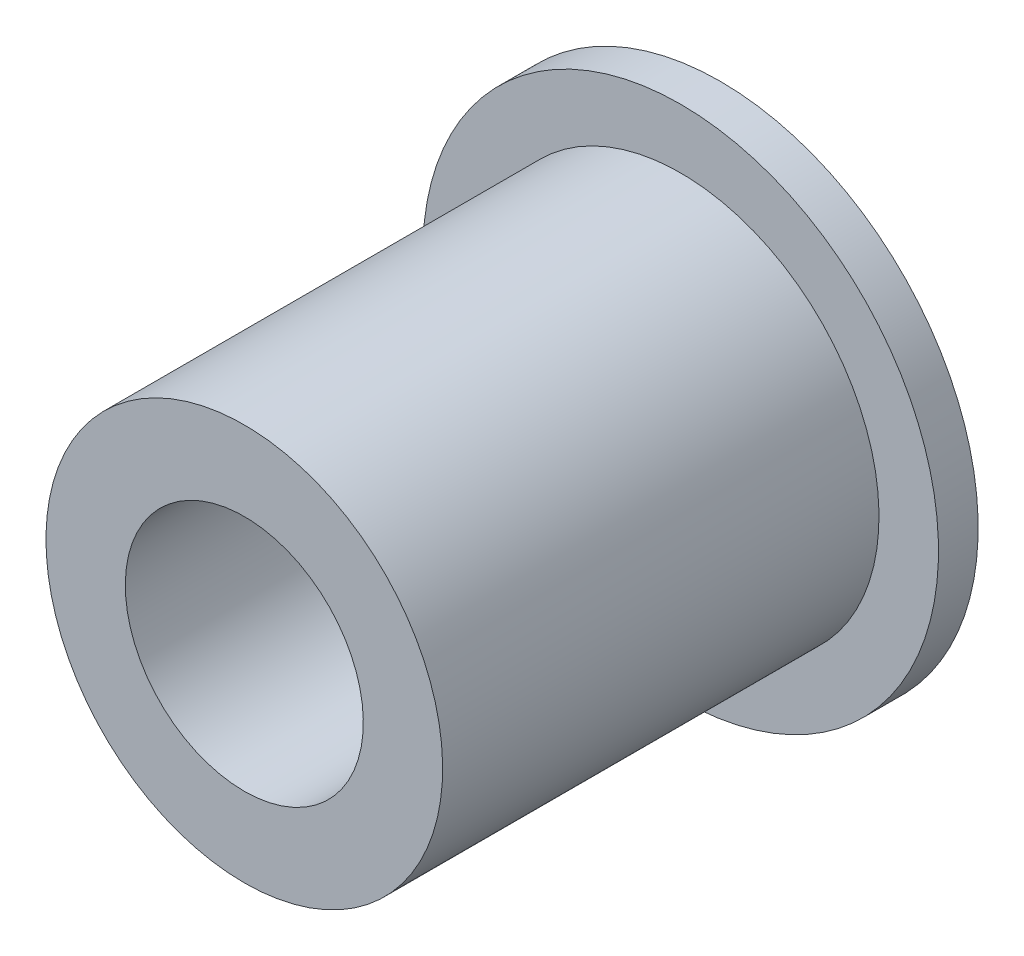
ISO-10303-21;
HEADER;
FILE_DESCRIPTION(('STEP AP214'),'2;1');
FILE_NAME('part.step','',(''),(''),'','','');
FILE_SCHEMA(('AUTOMOTIVE_DESIGN { 1 0 10303 214 1 1 1 1 }'));
ENDSEC;
DATA;
#1=APPLICATION_CONTEXT('core data for automotive mechanical design processes');
#2=APPLICATION_PROTOCOL_DEFINITION('international standard','automotive_design',2000,#1);
#3=PRODUCT_CONTEXT('',#1,'mechanical');
#4=PRODUCT('Part','Part','',(#3));
#5=PRODUCT_RELATED_PRODUCT_CATEGORY('part','',(#4));
#6=PRODUCT_DEFINITION_FORMATION('','',#4);
#7=PRODUCT_DEFINITION_CONTEXT('part definition',#1,'design');
#8=PRODUCT_DEFINITION('design','',#6,#7);
#9=PRODUCT_DEFINITION_SHAPE('','',#8);
#10=(LENGTH_UNIT() NAMED_UNIT(*) SI_UNIT(.MILLI.,.METRE.));
#11=(NAMED_UNIT(*) PLANE_ANGLE_UNIT() SI_UNIT($,.RADIAN.));
#12=(NAMED_UNIT(*) SI_UNIT($,.STERADIAN.) SOLID_ANGLE_UNIT());
#13=UNCERTAINTY_MEASURE_WITH_UNIT(LENGTH_MEASURE(1.E-05),#10,'distance_accuracy_value','');
#14=(GEOMETRIC_REPRESENTATION_CONTEXT(3) GLOBAL_UNCERTAINTY_ASSIGNED_CONTEXT((#13)) GLOBAL_UNIT_ASSIGNED_CONTEXT((#10,
#11,#12)) REPRESENTATION_CONTEXT('',''));
#15=CARTESIAN_POINT('',(0.,0.,0.));
#16=DIRECTION('',(0.,0.,1.));
#17=DIRECTION('',(1.,0.,0.));
#18=AXIS2_PLACEMENT_3D('',#15,#16,#17);
#19=CARTESIAN_POINT('',(-532.66652871477,241.494579256165,-7.80000038095353));
#20=DIRECTION('',(0.,0.,-1.));
#21=DIRECTION('',(-1.,0.,0.));
#22=AXIS2_PLACEMENT_3D('',#19,#20,#21);
#23=PLANE('',#22);
#24=CARTESIAN_POINT('',(-301.66652869975,234.024579380272,-7.80000038095361));
#25=DIRECTION('',(0.,0.,-1.));
#26=DIRECTION('',(0.,-1.,0.));
#27=AXIS2_PLACEMENT_3D('',#24,#25,#26);
#28=CIRCLE('',#27,3.25);
#29=CARTESIAN_POINT('',(-301.66652869975,230.774579380272,-7.80000038095361));
#30=VERTEX_POINT('',#29);
#31=EDGE_CURVE('E11',#30,#30,#28,.T.);
#32=ORIENTED_EDGE('',*,*,#31,.T.);
#33=EDGE_LOOP('',(#32));
#34=FACE_BOUND('',#33,.T.);
#35=ADVANCED_FACE('F16',(#34),#23,.T.);
#36=CARTESIAN_POINT('',(-301.66652869975,234.024579380272,-8.30000038095361));
#37=DIRECTION('',(0.,0.,-1.));
#38=DIRECTION('',(0.,-1.,0.));
#39=AXIS2_PLACEMENT_3D('',#36,#37,#38);
#40=CYLINDRICAL_SURFACE('',#39,3.25);
#41=CARTESIAN_POINT('',(-301.66652869975,234.024579380272,-7.30000038095361));
#42=DIRECTION('',(0.,0.,-1.));
#43=DIRECTION('',(0.,-1.,0.));
#44=AXIS2_PLACEMENT_3D('',#41,#42,#43);
#45=CIRCLE('',#44,3.25);
#46=CARTESIAN_POINT('',(-301.66652869975,230.774579380272,-7.30000038095361));
#47=VERTEX_POINT('',#46);
#48=EDGE_CURVE('E27',#47,#47,#45,.T.);
#49=ORIENTED_EDGE('',*,*,#48,.T.);
#50=EDGE_LOOP('',(#49));
#51=FACE_BOUND('',#50,.T.);
#52=ORIENTED_EDGE('',*,*,#31,.F.);
#53=EDGE_LOOP('',(#52));
#54=FACE_BOUND('',#53,.T.);
#55=ADVANCED_FACE('F78',(#51,#54),#40,.T.);
#56=CARTESIAN_POINT('',(-301.66652869975,231.024579380272,-7.30000038095361));
#57=DIRECTION('',(0.,0.,-1.));
#58=DIRECTION('',(-1.,0.,0.));
#59=AXIS2_PLACEMENT_3D('',#56,#57,#58);
#60=PLANE('',#59);
#61=ORIENTED_EDGE('',*,*,#48,.F.);
#62=EDGE_LOOP('',(#61));
#63=FACE_BOUND('',#62,.T.);
#64=CARTESIAN_POINT('',(-301.66652869975,234.024579380272,-7.30000038095361));
#65=DIRECTION('',(0.,0.,-1.));
#66=DIRECTION('',(0.,-1.,0.));
#67=AXIS2_PLACEMENT_3D('',#64,#65,#66);
#68=CIRCLE('',#67,2.5);
#69=CARTESIAN_POINT('',(-301.66652869975,231.524579380272,-7.30000038095361));
#70=VERTEX_POINT('',#69);
#71=EDGE_CURVE('E68',#70,#70,#68,.T.);
#72=ORIENTED_EDGE('',*,*,#71,.T.);
#73=EDGE_LOOP('',(#72));
#74=FACE_BOUND('',#73,.T.);
#75=ADVANCED_FACE('F80',(#63,#74),#60,.F.);
#76=CARTESIAN_POINT('',(-301.66652869975,234.024579380272,-3.30000038095361));
#77=DIRECTION('',(0.,0.,-1.));
#78=DIRECTION('',(0.,-1.,0.));
#79=AXIS2_PLACEMENT_3D('',#76,#77,#78);
#80=CYLINDRICAL_SURFACE('',#79,2.5);
#81=CARTESIAN_POINT('',(-301.66652869975,234.024579380272,-1.80000038095361));
#82=DIRECTION('',(0.,0.,-1.));
#83=DIRECTION('',(0.,-1.,0.));
#84=AXIS2_PLACEMENT_3D('',#81,#82,#83);
#85=CIRCLE('',#84,2.5);
#86=CARTESIAN_POINT('',(-301.66652869975,231.524579380272,-1.80000038095361));
#87=VERTEX_POINT('',#86);
#88=EDGE_CURVE('E20',#87,#87,#85,.T.);
#89=ORIENTED_EDGE('',*,*,#88,.T.);
#90=EDGE_LOOP('',(#89));
#91=FACE_BOUND('',#90,.T.);
#92=ORIENTED_EDGE('',*,*,#71,.F.);
#93=EDGE_LOOP('',(#92));
#94=FACE_BOUND('',#93,.T.);
#95=ADVANCED_FACE('F18',(#91,#94),#80,.T.);
#96=CARTESIAN_POINT('',(-301.66652869975,232.024579380272,-1.80000038095361));
#97=DIRECTION('',(0.,0.,-1.));
#98=DIRECTION('',(-1.,0.,0.));
#99=AXIS2_PLACEMENT_3D('',#96,#97,#98);
#100=PLANE('',#99);
#101=ORIENTED_EDGE('',*,*,#88,.F.);
#102=EDGE_LOOP('',(#101));
#103=FACE_BOUND('',#102,.T.);
#104=CARTESIAN_POINT('',(-301.66652869975,234.024579380272,-1.80000038095361));
#105=DIRECTION('',(0.,0.,-1.));
#106=DIRECTION('',(0.,-1.,0.));
#107=AXIS2_PLACEMENT_3D('',#104,#105,#106);
#108=CIRCLE('',#107,1.5);
#109=CARTESIAN_POINT('',(-301.66652869975,232.524579380272,-1.80000038095361));
#110=VERTEX_POINT('',#109);
#111=EDGE_CURVE('E59',#110,#110,#108,.T.);
#112=ORIENTED_EDGE('',*,*,#111,.T.);
#113=EDGE_LOOP('',(#112));
#114=FACE_BOUND('',#113,.T.);
#115=ADVANCED_FACE('F86',(#103,#114),#100,.F.);
#116=CARTESIAN_POINT('',(-301.66652869975,234.024579380272,-2.60000038095361));
#117=DIRECTION('',(0.,0.,-1.));
#118=DIRECTION('',(0.,-1.,0.));
#119=AXIS2_PLACEMENT_3D('',#116,#117,#118);
#120=CYLINDRICAL_SURFACE('',#119,1.5);
#121=CARTESIAN_POINT('',(-301.66652869975,234.024579380272,-7.70000038095361));
#122=DIRECTION('',(0.,0.,-1.));
#123=DIRECTION('',(0.,-1.,0.));
#124=AXIS2_PLACEMENT_3D('',#121,#122,#123);
#125=CIRCLE('',#124,1.5);
#126=CARTESIAN_POINT('',(-301.66652869975,232.524579380272,-7.70000038095361));
#127=VERTEX_POINT('',#126);
#128=EDGE_CURVE('E63',#127,#127,#125,.T.);
#129=ORIENTED_EDGE('',*,*,#128,.T.);
#130=EDGE_LOOP('',(#129));
#131=FACE_BOUND('',#130,.T.);
#132=ORIENTED_EDGE('',*,*,#111,.F.);
#133=EDGE_LOOP('',(#132));
#134=FACE_BOUND('',#133,.T.);
#135=ADVANCED_FACE('F60',(#131,#134),#120,.F.);
#136=CARTESIAN_POINT('',(-301.66652869975,233.274579380272,-7.70000038095361));
#137=DIRECTION('',(0.,0.,-1.));
#138=DIRECTION('',(-1.,0.,0.));
#139=AXIS2_PLACEMENT_3D('',#136,#137,#138);
#140=PLANE('',#139);
#141=ORIENTED_EDGE('',*,*,#128,.F.);
#142=EDGE_LOOP('',(#141));
#143=FACE_BOUND('',#142,.T.);
#144=ADVANCED_FACE('F100',(#143),#140,.F.);
#145=CLOSED_SHELL('',(#35,#55,#75,#95,#115,#135,#144));
#146=MANIFOLD_SOLID_BREP('B1',#145);
#147=ADVANCED_BREP_SHAPE_REPRESENTATION('',(#18,#146),#14);
#148=SHAPE_DEFINITION_REPRESENTATION(#9,#147);
ENDSEC;
END-ISO-10303-21;
